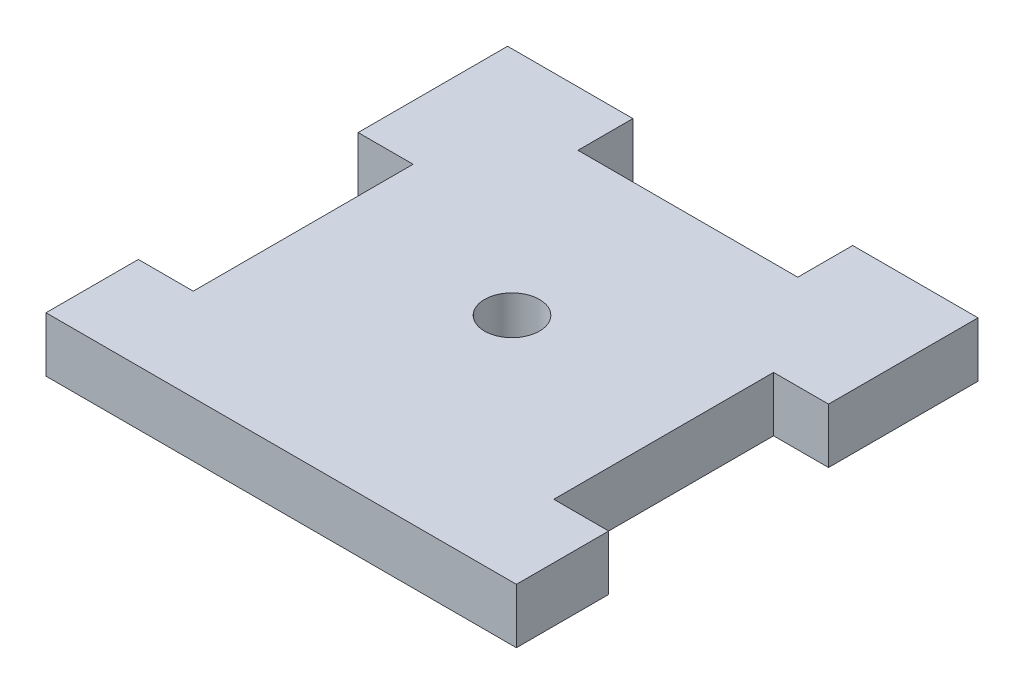
ISO-10303-21;
HEADER;
FILE_DESCRIPTION(('STEP AP214'),'2;1');
FILE_NAME('part.step','',(''),(''),'','','');
FILE_SCHEMA(('AUTOMOTIVE_DESIGN { 1 0 10303 214 1 1 1 1 }'));
ENDSEC;
DATA;
#1=APPLICATION_CONTEXT('core data for automotive mechanical design processes');
#2=APPLICATION_PROTOCOL_DEFINITION('international standard','automotive_design',2000,#1);
#3=PRODUCT_CONTEXT('',#1,'mechanical');
#4=PRODUCT('Part','Part','',(#3));
#5=PRODUCT_RELATED_PRODUCT_CATEGORY('part','',(#4));
#6=PRODUCT_DEFINITION_FORMATION('','',#4);
#7=PRODUCT_DEFINITION_CONTEXT('part definition',#1,'design');
#8=PRODUCT_DEFINITION('design','',#6,#7);
#9=PRODUCT_DEFINITION_SHAPE('','',#8);
#10=(LENGTH_UNIT() NAMED_UNIT(*) SI_UNIT(.MILLI.,.METRE.));
#11=(NAMED_UNIT(*) PLANE_ANGLE_UNIT() SI_UNIT($,.RADIAN.));
#12=(NAMED_UNIT(*) SI_UNIT($,.STERADIAN.) SOLID_ANGLE_UNIT());
#13=UNCERTAINTY_MEASURE_WITH_UNIT(LENGTH_MEASURE(1.E-05),#10,'distance_accuracy_value','');
#14=(GEOMETRIC_REPRESENTATION_CONTEXT(3) GLOBAL_UNCERTAINTY_ASSIGNED_CONTEXT((#13)) GLOBAL_UNIT_ASSIGNED_CONTEXT((#10,
#11,#12)) REPRESENTATION_CONTEXT('',''));
#15=CARTESIAN_POINT('',(0.,0.,0.));
#16=DIRECTION('',(0.,0.,1.));
#17=DIRECTION('',(1.,0.,0.));
#18=AXIS2_PLACEMENT_3D('',#15,#16,#17);
#19=CARTESIAN_POINT('',(0.,6.35,-10.668));
#20=DIRECTION('',(0.,-1.,0.));
#21=DIRECTION('',(0.,0.,-1.));
#22=AXIS2_PLACEMENT_3D('',#19,#20,#21);
#23=PLANE('',#22);
#24=DIRECTION('',(0.,0.,1.));
#25=VECTOR('',#24,1.);
#26=CARTESIAN_POINT('',(0.,6.35,0.));
#27=LINE('',#26,#25);
#28=CARTESIAN_POINT('',(0.,6.35,-10.668));
#29=VERTEX_POINT('',#28);
#30=CARTESIAN_POINT('',(0.,6.35,0.));
#31=VERTEX_POINT('',#30);
#32=EDGE_CURVE('E207',#29,#31,#27,.T.);
#33=ORIENTED_EDGE('',*,*,#32,.T.);
#34=DIRECTION('',(1.,0.,0.));
#35=VECTOR('',#34,1.);
#36=CARTESIAN_POINT('',(0.,6.35,0.));
#37=LINE('',#36,#35);
#38=CARTESIAN_POINT('',(54.356,6.35,0.));
#39=VERTEX_POINT('',#38);
#40=EDGE_CURVE('E115',#31,#39,#37,.T.);
#41=ORIENTED_EDGE('',*,*,#40,.T.);
#42=DIRECTION('',(0.,0.,-1.));
#43=VECTOR('',#42,1.);
#44=CARTESIAN_POINT('',(54.356,6.35,0.));
#45=LINE('',#44,#43);
#46=CARTESIAN_POINT('',(54.356,6.35,-10.668));
#47=VERTEX_POINT('',#46);
#48=EDGE_CURVE('E246',#39,#47,#45,.T.);
#49=ORIENTED_EDGE('',*,*,#48,.T.);
#50=DIRECTION('',(-1.,0.,0.));
#51=VECTOR('',#50,1.);
#52=CARTESIAN_POINT('',(54.356,6.35,-10.668));
#53=LINE('',#52,#51);
#54=CARTESIAN_POINT('',(48.006,6.35,-10.668));
#55=VERTEX_POINT('',#54);
#56=EDGE_CURVE('E265',#47,#55,#53,.T.);
#57=ORIENTED_EDGE('',*,*,#56,.T.);
#58=DIRECTION('',(0.,0.,-1.));
#59=VECTOR('',#58,1.);
#60=CARTESIAN_POINT('',(48.006,6.35,-36.068));
#61=LINE('',#60,#59);
#62=CARTESIAN_POINT('',(48.006,6.35,-36.068));
#63=VERTEX_POINT('',#62);
#64=EDGE_CURVE('E262',#55,#63,#61,.T.);
#65=ORIENTED_EDGE('',*,*,#64,.T.);
#66=DIRECTION('',(1.,0.,0.));
#67=VECTOR('',#66,1.);
#68=CARTESIAN_POINT('',(54.356,6.35,-36.068));
#69=LINE('',#68,#67);
#70=CARTESIAN_POINT('',(54.356,6.35,-36.068));
#71=VERTEX_POINT('',#70);
#72=EDGE_CURVE('E264',#63,#71,#69,.T.);
#73=ORIENTED_EDGE('',*,*,#72,.T.);
#74=DIRECTION('',(0.,0.,-1.));
#75=VECTOR('',#74,1.);
#76=CARTESIAN_POINT('',(54.356,6.35,-36.068));
#77=LINE('',#76,#75);
#78=CARTESIAN_POINT('',(54.356,6.35,-53.34));
#79=VERTEX_POINT('',#78);
#80=EDGE_CURVE('E267',#71,#79,#77,.T.);
#81=ORIENTED_EDGE('',*,*,#80,.T.);
#82=DIRECTION('',(-1.,0.,0.));
#83=VECTOR('',#82,1.);
#84=CARTESIAN_POINT('',(39.878,6.35,-53.34));
#85=LINE('',#84,#83);
#86=CARTESIAN_POINT('',(39.878,6.35,-53.34));
#87=VERTEX_POINT('',#86);
#88=EDGE_CURVE('E273',#79,#87,#85,.T.);
#89=ORIENTED_EDGE('',*,*,#88,.T.);
#90=DIRECTION('',(0.,0.,1.));
#91=VECTOR('',#90,1.);
#92=CARTESIAN_POINT('',(39.878,6.35,-46.99));
#93=LINE('',#92,#91);
#94=CARTESIAN_POINT('',(39.878,6.35,-46.99));
#95=VERTEX_POINT('',#94);
#96=EDGE_CURVE('E275',#87,#95,#93,.T.);
#97=ORIENTED_EDGE('',*,*,#96,.T.);
#98=DIRECTION('',(-1.,0.,0.));
#99=VECTOR('',#98,1.);
#100=CARTESIAN_POINT('',(14.478,6.35,-46.99));
#101=LINE('',#100,#99);
#102=CARTESIAN_POINT('',(14.478,6.35,-46.99));
#103=VERTEX_POINT('',#102);
#104=EDGE_CURVE('E277',#95,#103,#101,.T.);
#105=ORIENTED_EDGE('',*,*,#104,.T.);
#106=DIRECTION('',(0.,0.,-1.));
#107=VECTOR('',#106,1.);
#108=CARTESIAN_POINT('',(14.478,6.35,-53.34));
#109=LINE('',#108,#107);
#110=CARTESIAN_POINT('',(14.478,6.35,-53.34));
#111=VERTEX_POINT('',#110);
#112=EDGE_CURVE('E279',#103,#111,#109,.T.);
#113=ORIENTED_EDGE('',*,*,#112,.T.);
#114=DIRECTION('',(-1.,0.,0.));
#115=VECTOR('',#114,1.);
#116=CARTESIAN_POINT('',(0.,6.35,-53.34));
#117=LINE('',#116,#115);
#118=CARTESIAN_POINT('',(0.,6.35,-53.34));
#119=VERTEX_POINT('',#118);
#120=EDGE_CURVE('E281',#111,#119,#117,.T.);
#121=ORIENTED_EDGE('',*,*,#120,.T.);
#122=DIRECTION('',(0.,0.,1.));
#123=VECTOR('',#122,1.);
#124=CARTESIAN_POINT('',(0.,6.35,-36.068));
#125=LINE('',#124,#123);
#126=CARTESIAN_POINT('',(0.,6.35,-36.068));
#127=VERTEX_POINT('',#126);
#128=EDGE_CURVE('E158',#119,#127,#125,.T.);
#129=ORIENTED_EDGE('',*,*,#128,.T.);
#130=DIRECTION('',(1.,0.,0.));
#131=VECTOR('',#130,1.);
#132=CARTESIAN_POINT('',(0.,6.35,-36.068));
#133=LINE('',#132,#131);
#134=CARTESIAN_POINT('',(6.35,6.35,-36.068));
#135=VERTEX_POINT('',#134);
#136=EDGE_CURVE('E152',#127,#135,#133,.T.);
#137=ORIENTED_EDGE('',*,*,#136,.T.);
#138=DIRECTION('',(0.,0.,1.));
#139=VECTOR('',#138,1.);
#140=CARTESIAN_POINT('',(6.35,6.35,-36.068));
#141=LINE('',#140,#139);
#142=CARTESIAN_POINT('',(6.35,6.35,-10.668));
#143=VERTEX_POINT('',#142);
#144=EDGE_CURVE('E156',#135,#143,#141,.T.);
#145=ORIENTED_EDGE('',*,*,#144,.T.);
#146=DIRECTION('',(-1.,0.,0.));
#147=VECTOR('',#146,1.);
#148=CARTESIAN_POINT('',(0.,6.35,-10.668));
#149=LINE('',#148,#147);
#150=EDGE_CURVE('E48',#143,#29,#149,.T.);
#151=ORIENTED_EDGE('',*,*,#150,.T.);
#152=EDGE_LOOP('',(#33,#41,#49,#57,#65,#73,#81,#89,#97,#105,#113,#121,#129,#137,#145,#151));
#153=FACE_BOUND('',#152,.T.);
#154=CARTESIAN_POINT('',(27.178,6.35,-26.67));
#155=DIRECTION('',(0.,1.,0.));
#156=DIRECTION('',(0.,0.,1.));
#157=AXIS2_PLACEMENT_3D('',#154,#155,#156);
#158=CIRCLE('',#157,3.175);
#159=CARTESIAN_POINT('',(27.178,6.35,-23.495));
#160=VERTEX_POINT('',#159);
#161=EDGE_CURVE('E180',#160,#160,#158,.T.);
#162=ORIENTED_EDGE('',*,*,#161,.F.);
#163=EDGE_LOOP('',(#162));
#164=FACE_BOUND('',#163,.T.);
#165=ADVANCED_FACE('F31',(#153,#164),#23,.F.);
#166=CARTESIAN_POINT('',(0.,0.,-10.668));
#167=DIRECTION('',(0.,-1.,0.));
#168=DIRECTION('',(0.,0.,-1.));
#169=AXIS2_PLACEMENT_3D('',#166,#167,#168);
#170=PLANE('',#169);
#171=DIRECTION('',(0.,0.,1.));
#172=VECTOR('',#171,1.);
#173=CARTESIAN_POINT('',(0.,0.,0.));
#174=LINE('',#173,#172);
#175=CARTESIAN_POINT('',(0.,0.,-10.668));
#176=VERTEX_POINT('',#175);
#177=CARTESIAN_POINT('',(0.,0.,0.));
#178=VERTEX_POINT('',#177);
#179=EDGE_CURVE('E176',#176,#178,#174,.T.);
#180=ORIENTED_EDGE('',*,*,#179,.F.);
#181=DIRECTION('',(-1.,0.,0.));
#182=VECTOR('',#181,1.);
#183=CARTESIAN_POINT('',(0.,0.,-10.668));
#184=LINE('',#183,#182);
#185=CARTESIAN_POINT('',(6.35,0.,-10.668));
#186=VERTEX_POINT('',#185);
#187=EDGE_CURVE('E107',#186,#176,#184,.T.);
#188=ORIENTED_EDGE('',*,*,#187,.F.);
#189=DIRECTION('',(0.,0.,1.));
#190=VECTOR('',#189,1.);
#191=CARTESIAN_POINT('',(6.35,0.,-36.068));
#192=LINE('',#191,#190);
#193=CARTESIAN_POINT('',(6.35,0.,-36.068));
#194=VERTEX_POINT('',#193);
#195=EDGE_CURVE('E101',#194,#186,#192,.T.);
#196=ORIENTED_EDGE('',*,*,#195,.F.);
#197=DIRECTION('',(1.,0.,0.));
#198=VECTOR('',#197,1.);
#199=CARTESIAN_POINT('',(0.,0.,-36.068));
#200=LINE('',#199,#198);
#201=CARTESIAN_POINT('',(0.,0.,-36.068));
#202=VERTEX_POINT('',#201);
#203=EDGE_CURVE('E166',#202,#194,#200,.T.);
#204=ORIENTED_EDGE('',*,*,#203,.F.);
#205=DIRECTION('',(0.,0.,1.));
#206=VECTOR('',#205,1.);
#207=CARTESIAN_POINT('',(0.,0.,-36.068));
#208=LINE('',#207,#206);
#209=CARTESIAN_POINT('',(0.,0.,-53.34));
#210=VERTEX_POINT('',#209);
#211=EDGE_CURVE('E202',#210,#202,#208,.T.);
#212=ORIENTED_EDGE('',*,*,#211,.F.);
#213=DIRECTION('',(-1.,0.,0.));
#214=VECTOR('',#213,1.);
#215=CARTESIAN_POINT('',(0.,0.,-53.34));
#216=LINE('',#215,#214);
#217=CARTESIAN_POINT('',(14.478,0.,-53.34));
#218=VERTEX_POINT('',#217);
#219=EDGE_CURVE('E200',#218,#210,#216,.T.);
#220=ORIENTED_EDGE('',*,*,#219,.F.);
#221=DIRECTION('',(0.,0.,-1.));
#222=VECTOR('',#221,1.);
#223=CARTESIAN_POINT('',(14.478,0.,-53.34));
#224=LINE('',#223,#222);
#225=CARTESIAN_POINT('',(14.478,0.,-46.99));
#226=VERTEX_POINT('',#225);
#227=EDGE_CURVE('E198',#226,#218,#224,.T.);
#228=ORIENTED_EDGE('',*,*,#227,.F.);
#229=DIRECTION('',(-1.,0.,0.));
#230=VECTOR('',#229,1.);
#231=CARTESIAN_POINT('',(14.478,0.,-46.99));
#232=LINE('',#231,#230);
#233=CARTESIAN_POINT('',(39.878,0.,-46.99));
#234=VERTEX_POINT('',#233);
#235=EDGE_CURVE('E196',#234,#226,#232,.T.);
#236=ORIENTED_EDGE('',*,*,#235,.F.);
#237=DIRECTION('',(0.,0.,1.));
#238=VECTOR('',#237,1.);
#239=CARTESIAN_POINT('',(39.878,0.,-46.99));
#240=LINE('',#239,#238);
#241=CARTESIAN_POINT('',(39.878,0.,-53.34));
#242=VERTEX_POINT('',#241);
#243=EDGE_CURVE('E194',#242,#234,#240,.T.);
#244=ORIENTED_EDGE('',*,*,#243,.F.);
#245=DIRECTION('',(-1.,0.,0.));
#246=VECTOR('',#245,1.);
#247=CARTESIAN_POINT('',(39.878,0.,-53.34));
#248=LINE('',#247,#246);
#249=CARTESIAN_POINT('',(54.356,0.,-53.34));
#250=VERTEX_POINT('',#249);
#251=EDGE_CURVE('E192',#250,#242,#248,.T.);
#252=ORIENTED_EDGE('',*,*,#251,.F.);
#253=DIRECTION('',(0.,0.,-1.));
#254=VECTOR('',#253,1.);
#255=CARTESIAN_POINT('',(54.356,0.,-36.068));
#256=LINE('',#255,#254);
#257=CARTESIAN_POINT('',(54.356,0.,-36.068));
#258=VERTEX_POINT('',#257);
#259=EDGE_CURVE('E190',#258,#250,#256,.T.);
#260=ORIENTED_EDGE('',*,*,#259,.F.);
#261=DIRECTION('',(1.,0.,0.));
#262=VECTOR('',#261,1.);
#263=CARTESIAN_POINT('',(54.356,0.,-36.068));
#264=LINE('',#263,#262);
#265=CARTESIAN_POINT('',(48.006,0.,-36.068));
#266=VERTEX_POINT('',#265);
#267=EDGE_CURVE('E188',#266,#258,#264,.T.);
#268=ORIENTED_EDGE('',*,*,#267,.F.);
#269=DIRECTION('',(0.,0.,-1.));
#270=VECTOR('',#269,1.);
#271=CARTESIAN_POINT('',(48.006,0.,-36.068));
#272=LINE('',#271,#270);
#273=CARTESIAN_POINT('',(48.006,0.,-10.668));
#274=VERTEX_POINT('',#273);
#275=EDGE_CURVE('E186',#274,#266,#272,.T.);
#276=ORIENTED_EDGE('',*,*,#275,.F.);
#277=DIRECTION('',(-1.,0.,0.));
#278=VECTOR('',#277,1.);
#279=CARTESIAN_POINT('',(54.356,0.,-10.668));
#280=LINE('',#279,#278);
#281=CARTESIAN_POINT('',(54.356,0.,-10.668));
#282=VERTEX_POINT('',#281);
#283=EDGE_CURVE('E184',#282,#274,#280,.T.);
#284=ORIENTED_EDGE('',*,*,#283,.F.);
#285=DIRECTION('',(0.,0.,-1.));
#286=VECTOR('',#285,1.);
#287=CARTESIAN_POINT('',(54.356,0.,0.));
#288=LINE('',#287,#286);
#289=CARTESIAN_POINT('',(54.356,0.,0.));
#290=VERTEX_POINT('',#289);
#291=EDGE_CURVE('E182',#290,#282,#288,.T.);
#292=ORIENTED_EDGE('',*,*,#291,.F.);
#293=DIRECTION('',(1.,0.,0.));
#294=VECTOR('',#293,1.);
#295=CARTESIAN_POINT('',(0.,0.,0.));
#296=LINE('',#295,#294);
#297=EDGE_CURVE('E179',#178,#290,#296,.T.);
#298=ORIENTED_EDGE('',*,*,#297,.F.);
#299=EDGE_LOOP('',(#180,#188,#196,#204,#212,#220,#228,#236,#244,#252,#260,#268,#276,#284,#292,#298));
#300=FACE_BOUND('',#299,.T.);
#301=CARTESIAN_POINT('',(27.178,0.,-26.67));
#302=DIRECTION('',(0.,1.,0.));
#303=DIRECTION('',(0.,0.,1.));
#304=AXIS2_PLACEMENT_3D('',#301,#302,#303);
#305=CIRCLE('',#304,3.175);
#306=CARTESIAN_POINT('',(27.178,0.,-23.495));
#307=VERTEX_POINT('',#306);
#308=EDGE_CURVE('E480',#307,#307,#305,.T.);
#309=ORIENTED_EDGE('',*,*,#308,.T.);
#310=EDGE_LOOP('',(#309));
#311=FACE_BOUND('',#310,.T.);
#312=ADVANCED_FACE('F250',(#300,#311),#170,.T.);
#313=CARTESIAN_POINT('',(0.,6.35,0.));
#314=DIRECTION('',(1.,0.,0.));
#315=DIRECTION('',(0.,0.,-1.));
#316=AXIS2_PLACEMENT_3D('',#313,#314,#315);
#317=PLANE('',#316);
#318=ORIENTED_EDGE('',*,*,#179,.T.);
#319=DIRECTION('',(0.,-1.,0.));
#320=VECTOR('',#319,1.);
#321=CARTESIAN_POINT('',(0.,6.35,0.));
#322=LINE('',#321,#320);
#323=EDGE_CURVE('E11',#31,#178,#322,.T.);
#324=ORIENTED_EDGE('',*,*,#323,.F.);
#325=ORIENTED_EDGE('',*,*,#32,.F.);
#326=DIRECTION('',(0.,-1.,0.));
#327=VECTOR('',#326,1.);
#328=CARTESIAN_POINT('',(0.,6.35,-10.668));
#329=LINE('',#328,#327);
#330=EDGE_CURVE('E172',#29,#176,#329,.T.);
#331=ORIENTED_EDGE('',*,*,#330,.T.);
#332=EDGE_LOOP('',(#318,#324,#325,#331));
#333=FACE_BOUND('',#332,.T.);
#334=ADVANCED_FACE('F33',(#333),#317,.F.);
#335=CARTESIAN_POINT('',(0.,6.35,0.));
#336=DIRECTION('',(0.,0.,-1.));
#337=DIRECTION('',(-1.,0.,0.));
#338=AXIS2_PLACEMENT_3D('',#335,#336,#337);
#339=PLANE('',#338);
#340=ORIENTED_EDGE('',*,*,#297,.T.);
#341=DIRECTION('',(0.,-1.,0.));
#342=VECTOR('',#341,1.);
#343=CARTESIAN_POINT('',(54.356,6.35,0.));
#344=LINE('',#343,#342);
#345=EDGE_CURVE('E40',#39,#290,#344,.T.);
#346=ORIENTED_EDGE('',*,*,#345,.F.);
#347=ORIENTED_EDGE('',*,*,#40,.F.);
#348=ORIENTED_EDGE('',*,*,#323,.T.);
#349=EDGE_LOOP('',(#340,#346,#347,#348));
#350=FACE_BOUND('',#349,.T.);
#351=ADVANCED_FACE('F315',(#350),#339,.F.);
#352=CARTESIAN_POINT('',(54.356,6.35,0.));
#353=DIRECTION('',(-1.,0.,0.));
#354=DIRECTION('',(0.,0.,1.));
#355=AXIS2_PLACEMENT_3D('',#352,#353,#354);
#356=PLANE('',#355);
#357=ORIENTED_EDGE('',*,*,#291,.T.);
#358=DIRECTION('',(0.,-1.,0.));
#359=VECTOR('',#358,1.);
#360=CARTESIAN_POINT('',(54.356,6.35,-10.668));
#361=LINE('',#360,#359);
#362=EDGE_CURVE('E238',#47,#282,#361,.T.);
#363=ORIENTED_EDGE('',*,*,#362,.F.);
#364=ORIENTED_EDGE('',*,*,#48,.F.);
#365=ORIENTED_EDGE('',*,*,#345,.T.);
#366=EDGE_LOOP('',(#357,#363,#364,#365));
#367=FACE_BOUND('',#366,.T.);
#368=ADVANCED_FACE('F244',(#367),#356,.F.);
#369=CARTESIAN_POINT('',(54.356,6.35,-10.668));
#370=DIRECTION('',(0.,0.,1.));
#371=DIRECTION('',(1.,0.,0.));
#372=AXIS2_PLACEMENT_3D('',#369,#370,#371);
#373=PLANE('',#372);
#374=ORIENTED_EDGE('',*,*,#283,.T.);
#375=DIRECTION('',(0.,-1.,0.));
#376=VECTOR('',#375,1.);
#377=CARTESIAN_POINT('',(48.006,6.35,-10.668));
#378=LINE('',#377,#376);
#379=EDGE_CURVE('E235',#55,#274,#378,.T.);
#380=ORIENTED_EDGE('',*,*,#379,.F.);
#381=ORIENTED_EDGE('',*,*,#56,.F.);
#382=ORIENTED_EDGE('',*,*,#362,.T.);
#383=EDGE_LOOP('',(#374,#380,#381,#382));
#384=FACE_BOUND('',#383,.T.);
#385=ADVANCED_FACE('F256',(#384),#373,.F.);
#386=CARTESIAN_POINT('',(48.006,6.35,-36.068));
#387=DIRECTION('',(-1.,0.,0.));
#388=DIRECTION('',(0.,0.,1.));
#389=AXIS2_PLACEMENT_3D('',#386,#387,#388);
#390=PLANE('',#389);
#391=ORIENTED_EDGE('',*,*,#275,.T.);
#392=DIRECTION('',(0.,-1.,0.));
#393=VECTOR('',#392,1.);
#394=CARTESIAN_POINT('',(48.006,6.35,-36.068));
#395=LINE('',#394,#393);
#396=EDGE_CURVE('E232',#63,#266,#395,.T.);
#397=ORIENTED_EDGE('',*,*,#396,.F.);
#398=ORIENTED_EDGE('',*,*,#64,.F.);
#399=ORIENTED_EDGE('',*,*,#379,.T.);
#400=EDGE_LOOP('',(#391,#397,#398,#399));
#401=FACE_BOUND('',#400,.T.);
#402=ADVANCED_FACE('F260',(#401),#390,.F.);
#403=CARTESIAN_POINT('',(54.356,6.35,-36.068));
#404=DIRECTION('',(0.,0.,-1.));
#405=DIRECTION('',(-1.,0.,0.));
#406=AXIS2_PLACEMENT_3D('',#403,#404,#405);
#407=PLANE('',#406);
#408=ORIENTED_EDGE('',*,*,#267,.T.);
#409=DIRECTION('',(0.,-1.,0.));
#410=VECTOR('',#409,1.);
#411=CARTESIAN_POINT('',(54.356,6.35,-36.068));
#412=LINE('',#411,#410);
#413=EDGE_CURVE('E229',#71,#258,#412,.T.);
#414=ORIENTED_EDGE('',*,*,#413,.F.);
#415=ORIENTED_EDGE('',*,*,#72,.F.);
#416=ORIENTED_EDGE('',*,*,#396,.T.);
#417=EDGE_LOOP('',(#408,#414,#415,#416));
#418=FACE_BOUND('',#417,.T.);
#419=ADVANCED_FACE('F328',(#418),#407,.F.);
#420=CARTESIAN_POINT('',(54.356,6.35,-36.068));
#421=DIRECTION('',(-1.,0.,0.));
#422=DIRECTION('',(0.,0.,1.));
#423=AXIS2_PLACEMENT_3D('',#420,#421,#422);
#424=PLANE('',#423);
#425=ORIENTED_EDGE('',*,*,#259,.T.);
#426=DIRECTION('',(0.,-1.,0.));
#427=VECTOR('',#426,1.);
#428=CARTESIAN_POINT('',(54.356,6.35,-53.34));
#429=LINE('',#428,#427);
#430=EDGE_CURVE('E226',#79,#250,#429,.T.);
#431=ORIENTED_EDGE('',*,*,#430,.F.);
#432=ORIENTED_EDGE('',*,*,#80,.F.);
#433=ORIENTED_EDGE('',*,*,#413,.T.);
#434=EDGE_LOOP('',(#425,#431,#432,#433));
#435=FACE_BOUND('',#434,.T.);
#436=ADVANCED_FACE('F331',(#435),#424,.F.);
#437=CARTESIAN_POINT('',(39.878,6.35,-53.34));
#438=DIRECTION('',(0.,0.,1.));
#439=DIRECTION('',(1.,0.,0.));
#440=AXIS2_PLACEMENT_3D('',#437,#438,#439);
#441=PLANE('',#440);
#442=ORIENTED_EDGE('',*,*,#251,.T.);
#443=DIRECTION('',(0.,-1.,0.));
#444=VECTOR('',#443,1.);
#445=CARTESIAN_POINT('',(39.878,6.35,-53.34));
#446=LINE('',#445,#444);
#447=EDGE_CURVE('E223',#87,#242,#446,.T.);
#448=ORIENTED_EDGE('',*,*,#447,.F.);
#449=ORIENTED_EDGE('',*,*,#88,.F.);
#450=ORIENTED_EDGE('',*,*,#430,.T.);
#451=EDGE_LOOP('',(#442,#448,#449,#450));
#452=FACE_BOUND('',#451,.T.);
#453=ADVANCED_FACE('F335',(#452),#441,.F.);
#454=CARTESIAN_POINT('',(39.878,6.35,-46.99));
#455=DIRECTION('',(1.,0.,0.));
#456=DIRECTION('',(0.,0.,-1.));
#457=AXIS2_PLACEMENT_3D('',#454,#455,#456);
#458=PLANE('',#457);
#459=ORIENTED_EDGE('',*,*,#243,.T.);
#460=DIRECTION('',(0.,-1.,0.));
#461=VECTOR('',#460,1.);
#462=CARTESIAN_POINT('',(39.878,6.35,-46.99));
#463=LINE('',#462,#461);
#464=EDGE_CURVE('E220',#95,#234,#463,.T.);
#465=ORIENTED_EDGE('',*,*,#464,.F.);
#466=ORIENTED_EDGE('',*,*,#96,.F.);
#467=ORIENTED_EDGE('',*,*,#447,.T.);
#468=EDGE_LOOP('',(#459,#465,#466,#467));
#469=FACE_BOUND('',#468,.T.);
#470=ADVANCED_FACE('F339',(#469),#458,.F.);
#471=CARTESIAN_POINT('',(14.478,6.35,-46.99));
#472=DIRECTION('',(0.,0.,1.));
#473=DIRECTION('',(1.,0.,0.));
#474=AXIS2_PLACEMENT_3D('',#471,#472,#473);
#475=PLANE('',#474);
#476=ORIENTED_EDGE('',*,*,#235,.T.);
#477=DIRECTION('',(0.,-1.,0.));
#478=VECTOR('',#477,1.);
#479=CARTESIAN_POINT('',(14.478,6.35,-46.99));
#480=LINE('',#479,#478);
#481=EDGE_CURVE('E217',#103,#226,#480,.T.);
#482=ORIENTED_EDGE('',*,*,#481,.F.);
#483=ORIENTED_EDGE('',*,*,#104,.F.);
#484=ORIENTED_EDGE('',*,*,#464,.T.);
#485=EDGE_LOOP('',(#476,#482,#483,#484));
#486=FACE_BOUND('',#485,.T.);
#487=ADVANCED_FACE('F343',(#486),#475,.F.);
#488=CARTESIAN_POINT('',(14.478,6.35,-53.34));
#489=DIRECTION('',(-1.,0.,0.));
#490=DIRECTION('',(0.,0.,1.));
#491=AXIS2_PLACEMENT_3D('',#488,#489,#490);
#492=PLANE('',#491);
#493=ORIENTED_EDGE('',*,*,#227,.T.);
#494=DIRECTION('',(0.,-1.,0.));
#495=VECTOR('',#494,1.);
#496=CARTESIAN_POINT('',(14.478,6.35,-53.34));
#497=LINE('',#496,#495);
#498=EDGE_CURVE('E214',#111,#218,#497,.T.);
#499=ORIENTED_EDGE('',*,*,#498,.F.);
#500=ORIENTED_EDGE('',*,*,#112,.F.);
#501=ORIENTED_EDGE('',*,*,#481,.T.);
#502=EDGE_LOOP('',(#493,#499,#500,#501));
#503=FACE_BOUND('',#502,.T.);
#504=ADVANCED_FACE('F347',(#503),#492,.F.);
#505=CARTESIAN_POINT('',(0.,6.35,-53.34));
#506=DIRECTION('',(0.,0.,1.));
#507=DIRECTION('',(1.,0.,0.));
#508=AXIS2_PLACEMENT_3D('',#505,#506,#507);
#509=PLANE('',#508);
#510=ORIENTED_EDGE('',*,*,#219,.T.);
#511=DIRECTION('',(0.,-1.,0.));
#512=VECTOR('',#511,1.);
#513=CARTESIAN_POINT('',(0.,6.35,-53.34));
#514=LINE('',#513,#512);
#515=EDGE_CURVE('E211',#119,#210,#514,.T.);
#516=ORIENTED_EDGE('',*,*,#515,.F.);
#517=ORIENTED_EDGE('',*,*,#120,.F.);
#518=ORIENTED_EDGE('',*,*,#498,.T.);
#519=EDGE_LOOP('',(#510,#516,#517,#518));
#520=FACE_BOUND('',#519,.T.);
#521=ADVANCED_FACE('F287',(#520),#509,.F.);
#522=CARTESIAN_POINT('',(0.,6.35,-36.068));
#523=DIRECTION('',(1.,0.,0.));
#524=DIRECTION('',(0.,0.,-1.));
#525=AXIS2_PLACEMENT_3D('',#522,#523,#524);
#526=PLANE('',#525);
#527=ORIENTED_EDGE('',*,*,#211,.T.);
#528=DIRECTION('',(0.,-1.,0.));
#529=VECTOR('',#528,1.);
#530=CARTESIAN_POINT('',(0.,6.35,-36.068));
#531=LINE('',#530,#529);
#532=EDGE_CURVE('E167',#127,#202,#531,.T.);
#533=ORIENTED_EDGE('',*,*,#532,.F.);
#534=ORIENTED_EDGE('',*,*,#128,.F.);
#535=ORIENTED_EDGE('',*,*,#515,.T.);
#536=EDGE_LOOP('',(#527,#533,#534,#535));
#537=FACE_BOUND('',#536,.T.);
#538=ADVANCED_FACE('F291',(#537),#526,.F.);
#539=CARTESIAN_POINT('',(0.,6.35,-36.068));
#540=DIRECTION('',(0.,0.,-1.));
#541=DIRECTION('',(-1.,0.,0.));
#542=AXIS2_PLACEMENT_3D('',#539,#540,#541);
#543=PLANE('',#542);
#544=ORIENTED_EDGE('',*,*,#203,.T.);
#545=DIRECTION('',(0.,-1.,0.));
#546=VECTOR('',#545,1.);
#547=CARTESIAN_POINT('',(6.35,6.35,-36.068));
#548=LINE('',#547,#546);
#549=EDGE_CURVE('E163',#135,#194,#548,.T.);
#550=ORIENTED_EDGE('',*,*,#549,.F.);
#551=ORIENTED_EDGE('',*,*,#136,.F.);
#552=ORIENTED_EDGE('',*,*,#532,.T.);
#553=EDGE_LOOP('',(#544,#550,#551,#552));
#554=FACE_BOUND('',#553,.T.);
#555=ADVANCED_FACE('F164',(#554),#543,.F.);
#556=CARTESIAN_POINT('',(6.35,6.35,-36.068));
#557=DIRECTION('',(1.,0.,0.));
#558=DIRECTION('',(0.,0.,-1.));
#559=AXIS2_PLACEMENT_3D('',#556,#557,#558);
#560=PLANE('',#559);
#561=ORIENTED_EDGE('',*,*,#195,.T.);
#562=DIRECTION('',(0.,-1.,0.));
#563=VECTOR('',#562,1.);
#564=CARTESIAN_POINT('',(6.35,6.35,-10.668));
#565=LINE('',#564,#563);
#566=EDGE_CURVE('E168',#143,#186,#565,.T.);
#567=ORIENTED_EDGE('',*,*,#566,.F.);
#568=ORIENTED_EDGE('',*,*,#144,.F.);
#569=ORIENTED_EDGE('',*,*,#549,.T.);
#570=EDGE_LOOP('',(#561,#567,#568,#569));
#571=FACE_BOUND('',#570,.T.);
#572=ADVANCED_FACE('F170',(#571),#560,.F.);
#573=CARTESIAN_POINT('',(0.,6.35,-10.668));
#574=DIRECTION('',(0.,0.,1.));
#575=DIRECTION('',(1.,0.,0.));
#576=AXIS2_PLACEMENT_3D('',#573,#574,#575);
#577=PLANE('',#576);
#578=ORIENTED_EDGE('',*,*,#187,.T.);
#579=ORIENTED_EDGE('',*,*,#330,.F.);
#580=ORIENTED_EDGE('',*,*,#150,.F.);
#581=ORIENTED_EDGE('',*,*,#566,.T.);
#582=EDGE_LOOP('',(#578,#579,#580,#581));
#583=FACE_BOUND('',#582,.T.);
#584=ADVANCED_FACE('F295',(#583),#577,.F.);
#585=CARTESIAN_POINT('',(27.178,6.35,-26.67));
#586=DIRECTION('',(0.,-1.,0.));
#587=DIRECTION('',(0.,0.,-1.));
#588=AXIS2_PLACEMENT_3D('',#585,#586,#587);
#589=CYLINDRICAL_SURFACE('',#588,3.175);
#590=ORIENTED_EDGE('',*,*,#161,.T.);
#591=EDGE_LOOP('',(#590));
#592=FACE_BOUND('',#591,.T.);
#593=ORIENTED_EDGE('',*,*,#308,.F.);
#594=EDGE_LOOP('',(#593));
#595=FACE_BOUND('',#594,.T.);
#596=ADVANCED_FACE('F297',(#592,#595),#589,.F.);
#597=CLOSED_SHELL('',(#165,#312,#334,#351,#368,#385,#402,#419,#436,#453,#470,#487,#504,#521,
#538,#555,#572,#584,#596));
#598=MANIFOLD_SOLID_BREP('B2',#597);
#599=ADVANCED_BREP_SHAPE_REPRESENTATION('',(#18,#598),#14);
#600=SHAPE_DEFINITION_REPRESENTATION(#9,#599);
ENDSEC;
END-ISO-10303-21;
